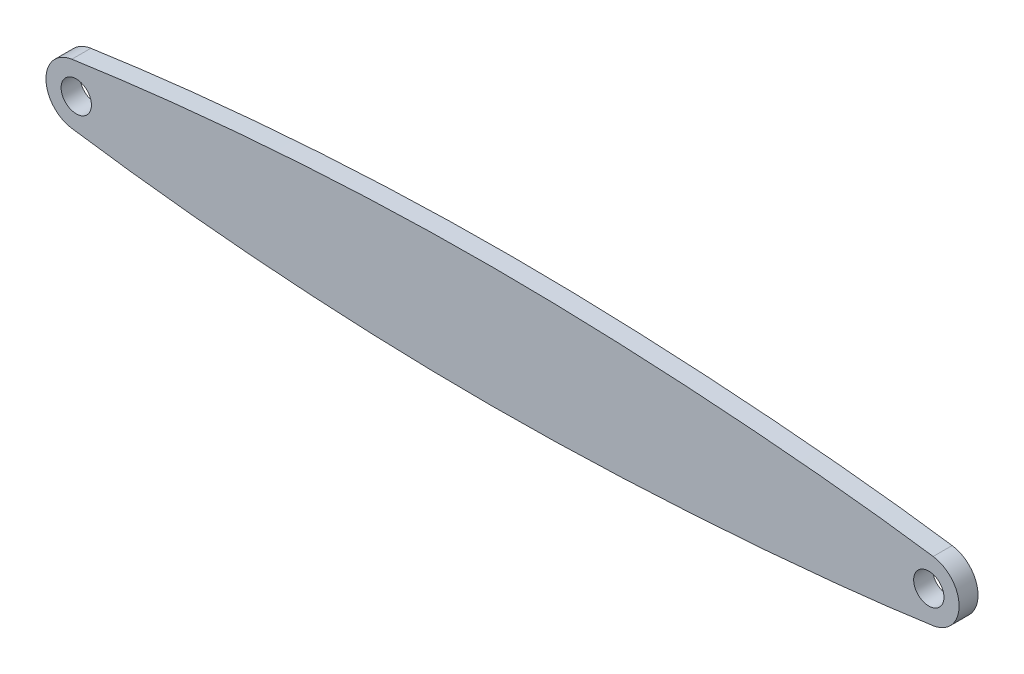
ISO-10303-21;
HEADER;
FILE_DESCRIPTION(('STEP AP214'),'2;1');
FILE_NAME('part.step','',(''),(''),'','','');
FILE_SCHEMA(('AUTOMOTIVE_DESIGN { 1 0 10303 214 1 1 1 1 }'));
ENDSEC;
DATA;
#1=APPLICATION_CONTEXT('core data for automotive mechanical design processes');
#2=APPLICATION_PROTOCOL_DEFINITION('international standard','automotive_design',2000,#1);
#3=PRODUCT_CONTEXT('',#1,'mechanical');
#4=PRODUCT('Part','Part','',(#3));
#5=PRODUCT_RELATED_PRODUCT_CATEGORY('part','',(#4));
#6=PRODUCT_DEFINITION_FORMATION('','',#4);
#7=PRODUCT_DEFINITION_CONTEXT('part definition',#1,'design');
#8=PRODUCT_DEFINITION('design','',#6,#7);
#9=PRODUCT_DEFINITION_SHAPE('','',#8);
#10=(LENGTH_UNIT() NAMED_UNIT(*) SI_UNIT(.MILLI.,.METRE.));
#11=(NAMED_UNIT(*) PLANE_ANGLE_UNIT() SI_UNIT($,.RADIAN.));
#12=(NAMED_UNIT(*) SI_UNIT($,.STERADIAN.) SOLID_ANGLE_UNIT());
#13=UNCERTAINTY_MEASURE_WITH_UNIT(LENGTH_MEASURE(1.E-05),#10,'distance_accuracy_value','');
#14=(GEOMETRIC_REPRESENTATION_CONTEXT(3) GLOBAL_UNCERTAINTY_ASSIGNED_CONTEXT((#13)) GLOBAL_UNIT_ASSIGNED_CONTEXT((#10,
#11,#12)) REPRESENTATION_CONTEXT('',''));
#15=CARTESIAN_POINT('',(0.,0.,0.));
#16=DIRECTION('',(0.,0.,1.));
#17=DIRECTION('',(1.,0.,0.));
#18=AXIS2_PLACEMENT_3D('',#15,#16,#17);
#19=CARTESIAN_POINT('',(225.,31.8025836952006,10.));
#20=DIRECTION('',(0.,0.,1.));
#21=DIRECTION('',(1.,0.,0.));
#22=AXIS2_PLACEMENT_3D('',#19,#20,#21);
#23=PLANE('',#22);
#24=CARTESIAN_POINT('',(0.,0.,10.));
#25=DIRECTION('',(0.,0.,1.));
#26=DIRECTION('',(1.,0.,0.));
#27=AXIS2_PLACEMENT_3D('',#24,#25,#26);
#28=CIRCLE('',#27,8.);
#29=CARTESIAN_POINT('',(8.,0.,10.));
#30=VERTEX_POINT('',#29);
#31=EDGE_CURVE('E147',#30,#30,#28,.T.);
#32=ORIENTED_EDGE('',*,*,#31,.F.);
#33=EDGE_LOOP('',(#32));
#34=FACE_BOUND('',#33,.T.);
#35=CARTESIAN_POINT('',(452.313590971263,15.8318443909006,10.));
#36=CARTESIAN_POINT('',(399.013095207735,23.6209271229923,10.));
#37=CARTESIAN_POINT('',(219.572103506326,39.1910331077978,10.));
#38=CARTESIAN_POINT('',(61.8426977796127,25.2073414422146,10.));
#39=CARTESIAN_POINT('',(-2.31359097126271,15.8318443909006,10.));
#40=B_SPLINE_CURVE_WITH_KNOTS('',3,(#35,#36,#37,#38,#39),.UNSPECIFIED.,.F.,.F.,(4,1,4),(0.,0.5,
1.),.UNSPECIFIED.);
#41=CARTESIAN_POINT('',(452.313590971263,15.8318443909006,10.));
#42=VERTEX_POINT('',#41);
#43=CARTESIAN_POINT('',(-2.31359097126274,15.8318443909006,10.));
#44=VERTEX_POINT('',#43);
#45=EDGE_CURVE('E89',#42,#44,#40,.T.);
#46=ORIENTED_EDGE('',*,*,#45,.T.);
#47=CARTESIAN_POINT('',(0.,0.,10.));
#48=DIRECTION('',(0.,0.,1.));
#49=DIRECTION('',(1.,0.,0.));
#50=AXIS2_PLACEMENT_3D('',#47,#48,#49);
#51=CIRCLE('',#50,16.);
#52=CARTESIAN_POINT('',(-2.31359097126274,-15.8318443909006,10.));
#53=VERTEX_POINT('',#52);
#54=EDGE_CURVE('E84',#44,#53,#51,.T.);
#55=ORIENTED_EDGE('',*,*,#54,.T.);
#56=CARTESIAN_POINT('',(-2.31359097126271,-15.8318443909006,10.));
#57=CARTESIAN_POINT('',(61.8426977796127,-25.2073414422146,10.));
#58=CARTESIAN_POINT('',(219.572103506326,-39.1910331077978,10.));
#59=CARTESIAN_POINT('',(399.013095207735,-23.6209271229923,10.));
#60=CARTESIAN_POINT('',(452.313590971263,-15.8318443909006,10.));
#61=B_SPLINE_CURVE_WITH_KNOTS('',3,(#56,#57,#58,#59,#60),.UNSPECIFIED.,.F.,.F.,(4,1,4),(0.,0.5,
1.),.UNSPECIFIED.);
#62=CARTESIAN_POINT('',(452.313590971263,-15.8318443909006,10.));
#63=VERTEX_POINT('',#62);
#64=EDGE_CURVE('E87',#53,#63,#61,.T.);
#65=ORIENTED_EDGE('',*,*,#64,.T.);
#66=CARTESIAN_POINT('',(450.,0.,10.));
#67=DIRECTION('',(0.,0.,1.));
#68=DIRECTION('',(1.,0.,0.));
#69=AXIS2_PLACEMENT_3D('',#66,#67,#68);
#70=CIRCLE('',#69,16.);
#71=EDGE_CURVE('E54',#63,#42,#70,.T.);
#72=ORIENTED_EDGE('',*,*,#71,.T.);
#73=EDGE_LOOP('',(#46,#55,#65,#72));
#74=FACE_BOUND('',#73,.T.);
#75=CARTESIAN_POINT('',(450.,0.,10.));
#76=DIRECTION('',(0.,0.,1.));
#77=DIRECTION('',(1.,0.,0.));
#78=AXIS2_PLACEMENT_3D('',#75,#76,#77);
#79=CIRCLE('',#78,7.99999999999998);
#80=CARTESIAN_POINT('',(458.,0.,10.));
#81=VERTEX_POINT('',#80);
#82=EDGE_CURVE('E138',#81,#81,#79,.T.);
#83=ORIENTED_EDGE('',*,*,#82,.F.);
#84=EDGE_LOOP('',(#83));
#85=FACE_BOUND('',#84,.T.);
#86=ADVANCED_FACE('F36',(#34,#74,#85),#23,.T.);
#87=CARTESIAN_POINT('',(225.,31.8025836952006,0.));
#88=DIRECTION('',(0.,0.,1.));
#89=DIRECTION('',(1.,0.,0.));
#90=AXIS2_PLACEMENT_3D('',#87,#88,#89);
#91=PLANE('',#90);
#92=CARTESIAN_POINT('',(452.313590971263,15.8318443909006,0.));
#93=CARTESIAN_POINT('',(399.013095207735,23.6209271229923,0.));
#94=CARTESIAN_POINT('',(219.572103506326,39.1910331077978,0.));
#95=CARTESIAN_POINT('',(61.8426977796127,25.2073414422146,0.));
#96=CARTESIAN_POINT('',(-2.31359097126271,15.8318443909006,0.));
#97=B_SPLINE_CURVE_WITH_KNOTS('',3,(#92,#93,#94,#95,#96),.UNSPECIFIED.,.F.,.F.,(4,1,4),(0.,0.5,
1.),.UNSPECIFIED.);
#98=CARTESIAN_POINT('',(452.313590971263,15.8318443909006,0.));
#99=VERTEX_POINT('',#98);
#100=CARTESIAN_POINT('',(-2.31359097126274,15.8318443909006,0.));
#101=VERTEX_POINT('',#100);
#102=EDGE_CURVE('E150',#99,#101,#97,.T.);
#103=ORIENTED_EDGE('',*,*,#102,.F.);
#104=CARTESIAN_POINT('',(450.,0.,0.));
#105=DIRECTION('',(0.,0.,1.));
#106=DIRECTION('',(1.,0.,0.));
#107=AXIS2_PLACEMENT_3D('',#104,#105,#106);
#108=CIRCLE('',#107,16.);
#109=CARTESIAN_POINT('',(452.313590971263,-15.8318443909006,0.));
#110=VERTEX_POINT('',#109);
#111=EDGE_CURVE('E77',#110,#99,#108,.T.);
#112=ORIENTED_EDGE('',*,*,#111,.F.);
#113=CARTESIAN_POINT('',(-2.31359097126271,-15.8318443909006,0.));
#114=CARTESIAN_POINT('',(61.8426977796127,-25.2073414422146,0.));
#115=CARTESIAN_POINT('',(219.572103506326,-39.1910331077978,0.));
#116=CARTESIAN_POINT('',(399.013095207735,-23.6209271229923,0.));
#117=CARTESIAN_POINT('',(452.313590971263,-15.8318443909006,0.));
#118=B_SPLINE_CURVE_WITH_KNOTS('',3,(#113,#114,#115,#116,#117),.UNSPECIFIED.,.F.,.F.,(4,1,4),
(0.,0.5,1.),.UNSPECIFIED.);
#119=CARTESIAN_POINT('',(-2.31359097126274,-15.8318443909006,0.));
#120=VERTEX_POINT('',#119);
#121=EDGE_CURVE('E71',#120,#110,#118,.T.);
#122=ORIENTED_EDGE('',*,*,#121,.F.);
#123=CARTESIAN_POINT('',(0.,0.,0.));
#124=DIRECTION('',(0.,0.,1.));
#125=DIRECTION('',(1.,0.,0.));
#126=AXIS2_PLACEMENT_3D('',#123,#124,#125);
#127=CIRCLE('',#126,16.);
#128=EDGE_CURVE('E93',#101,#120,#127,.T.);
#129=ORIENTED_EDGE('',*,*,#128,.F.);
#130=EDGE_LOOP('',(#103,#112,#122,#129));
#131=FACE_BOUND('',#130,.T.);
#132=CARTESIAN_POINT('',(0.,0.,0.));
#133=DIRECTION('',(0.,0.,1.));
#134=DIRECTION('',(1.,0.,0.));
#135=AXIS2_PLACEMENT_3D('',#132,#133,#134);
#136=CIRCLE('',#135,8.);
#137=CARTESIAN_POINT('',(8.,0.,0.));
#138=VERTEX_POINT('',#137);
#139=EDGE_CURVE('E144',#138,#138,#136,.T.);
#140=ORIENTED_EDGE('',*,*,#139,.T.);
#141=EDGE_LOOP('',(#140));
#142=FACE_BOUND('',#141,.T.);
#143=CARTESIAN_POINT('',(450.,0.,0.));
#144=DIRECTION('',(0.,0.,1.));
#145=DIRECTION('',(1.,0.,0.));
#146=AXIS2_PLACEMENT_3D('',#143,#144,#145);
#147=CIRCLE('',#146,7.99999999999998);
#148=CARTESIAN_POINT('',(458.,0.,0.));
#149=VERTEX_POINT('',#148);
#150=EDGE_CURVE('E141',#149,#149,#147,.T.);
#151=ORIENTED_EDGE('',*,*,#150,.T.);
#152=EDGE_LOOP('',(#151));
#153=FACE_BOUND('',#152,.T.);
#154=ADVANCED_FACE('F115',(#131,#142,#153),#91,.F.);
#155=DIRECTION('',(0.,0.,-1.));
#156=VECTOR('',#155,1.);
#157=SURFACE_OF_LINEAR_EXTRUSION('',#40,#156);
#158=ORIENTED_EDGE('',*,*,#102,.T.);
#159=DIRECTION('',(0.,0.,-1.));
#160=VECTOR('',#159,1.);
#161=CARTESIAN_POINT('',(-2.31359097126274,15.8318443909006,10.));
#162=LINE('',#161,#160);
#163=EDGE_CURVE('E11',#44,#101,#162,.T.);
#164=ORIENTED_EDGE('',*,*,#163,.F.);
#165=ORIENTED_EDGE('',*,*,#45,.F.);
#166=DIRECTION('',(0.,0.,-1.));
#167=VECTOR('',#166,1.);
#168=CARTESIAN_POINT('',(452.313590971263,15.8318443909006,10.));
#169=LINE('',#168,#167);
#170=EDGE_CURVE('E97',#42,#99,#169,.T.);
#171=ORIENTED_EDGE('',*,*,#170,.T.);
#172=EDGE_LOOP('',(#158,#164,#165,#171));
#173=FACE_BOUND('',#172,.T.);
#174=ADVANCED_FACE('F38',(#173),#157,.F.);
#175=CARTESIAN_POINT('',(0.,0.,10.));
#176=DIRECTION('',(0.,0.,-1.));
#177=DIRECTION('',(-1.,0.,0.));
#178=AXIS2_PLACEMENT_3D('',#175,#176,#177);
#179=CYLINDRICAL_SURFACE('',#178,16.);
#180=ORIENTED_EDGE('',*,*,#128,.T.);
#181=DIRECTION('',(0.,0.,-1.));
#182=VECTOR('',#181,1.);
#183=CARTESIAN_POINT('',(-2.31359097126274,-15.8318443909006,10.));
#184=LINE('',#183,#182);
#185=EDGE_CURVE('E46',#53,#120,#184,.T.);
#186=ORIENTED_EDGE('',*,*,#185,.F.);
#187=ORIENTED_EDGE('',*,*,#54,.F.);
#188=ORIENTED_EDGE('',*,*,#163,.T.);
#189=EDGE_LOOP('',(#180,#186,#187,#188));
#190=FACE_BOUND('',#189,.T.);
#191=ADVANCED_FACE('F92',(#190),#179,.T.);
#192=DIRECTION('',(0.,0.,-1.));
#193=VECTOR('',#192,1.);
#194=SURFACE_OF_LINEAR_EXTRUSION('',#61,#193);
#195=ORIENTED_EDGE('',*,*,#121,.T.);
#196=DIRECTION('',(0.,0.,-1.));
#197=VECTOR('',#196,1.);
#198=CARTESIAN_POINT('',(452.313590971263,-15.8318443909006,10.));
#199=LINE('',#198,#197);
#200=EDGE_CURVE('E94',#63,#110,#199,.T.);
#201=ORIENTED_EDGE('',*,*,#200,.F.);
#202=ORIENTED_EDGE('',*,*,#64,.F.);
#203=ORIENTED_EDGE('',*,*,#185,.T.);
#204=EDGE_LOOP('',(#195,#201,#202,#203));
#205=FACE_BOUND('',#204,.T.);
#206=ADVANCED_FACE('F95',(#205),#194,.F.);
#207=CARTESIAN_POINT('',(450.,0.,10.));
#208=DIRECTION('',(0.,0.,-1.));
#209=DIRECTION('',(-1.,0.,0.));
#210=AXIS2_PLACEMENT_3D('',#207,#208,#209);
#211=CYLINDRICAL_SURFACE('',#210,16.);
#212=ORIENTED_EDGE('',*,*,#111,.T.);
#213=ORIENTED_EDGE('',*,*,#170,.F.);
#214=ORIENTED_EDGE('',*,*,#71,.F.);
#215=ORIENTED_EDGE('',*,*,#200,.T.);
#216=EDGE_LOOP('',(#212,#213,#214,#215));
#217=FACE_BOUND('',#216,.T.);
#218=ADVANCED_FACE('F109',(#217),#211,.T.);
#219=CARTESIAN_POINT('',(0.,0.,10.));
#220=DIRECTION('',(0.,0.,-1.));
#221=DIRECTION('',(-1.,0.,0.));
#222=AXIS2_PLACEMENT_3D('',#219,#220,#221);
#223=CYLINDRICAL_SURFACE('',#222,8.);
#224=ORIENTED_EDGE('',*,*,#31,.T.);
#225=EDGE_LOOP('',(#224));
#226=FACE_BOUND('',#225,.T.);
#227=ORIENTED_EDGE('',*,*,#139,.F.);
#228=EDGE_LOOP('',(#227));
#229=FACE_BOUND('',#228,.T.);
#230=ADVANCED_FACE('F126',(#226,#229),#223,.F.);
#231=CARTESIAN_POINT('',(450.,0.,10.));
#232=DIRECTION('',(0.,0.,-1.));
#233=DIRECTION('',(-1.,0.,0.));
#234=AXIS2_PLACEMENT_3D('',#231,#232,#233);
#235=CYLINDRICAL_SURFACE('',#234,7.99999999999998);
#236=ORIENTED_EDGE('',*,*,#82,.T.);
#237=EDGE_LOOP('',(#236));
#238=FACE_BOUND('',#237,.T.);
#239=ORIENTED_EDGE('',*,*,#150,.F.);
#240=EDGE_LOOP('',(#239));
#241=FACE_BOUND('',#240,.T.);
#242=ADVANCED_FACE('F129',(#238,#241),#235,.F.);
#243=CLOSED_SHELL('',(#86,#154,#174,#191,#206,#218,#230,#242));
#244=MANIFOLD_SOLID_BREP('B2',#243);
#245=ADVANCED_BREP_SHAPE_REPRESENTATION('',(#18,#244),#14);
#246=SHAPE_DEFINITION_REPRESENTATION(#9,#245);
ENDSEC;
END-ISO-10303-21;
